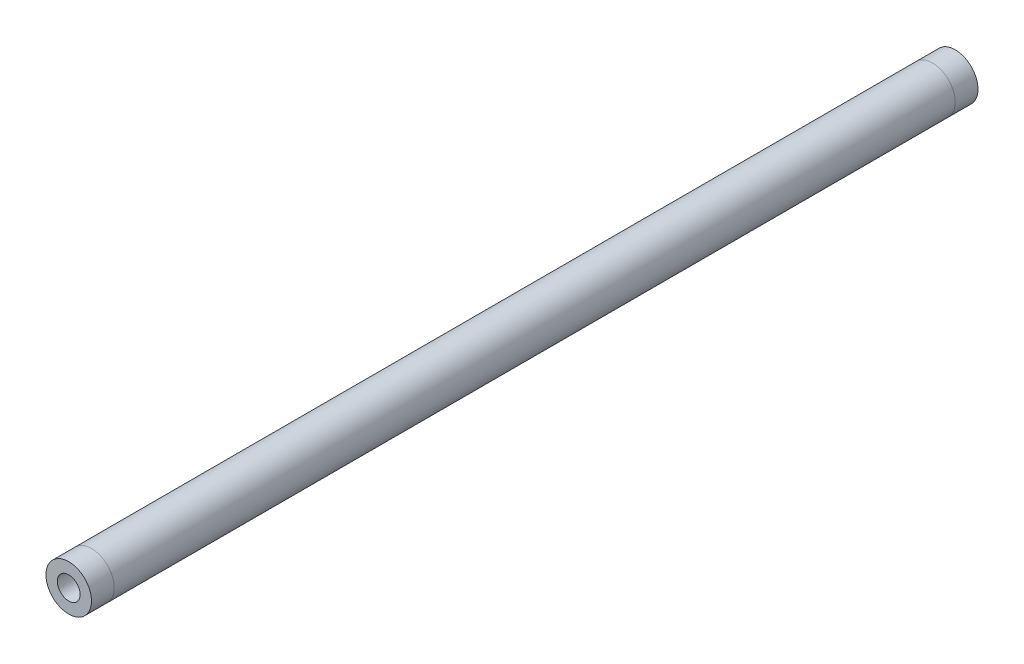
ISO-10303-21;
HEADER;
FILE_DESCRIPTION(('STEP AP214'),'2;1');
FILE_NAME('part.step','',(''),(''),'','','');
FILE_SCHEMA(('AUTOMOTIVE_DESIGN { 1 0 10303 214 1 1 1 1 }'));
ENDSEC;
DATA;
#1=APPLICATION_CONTEXT('core data for automotive mechanical design processes');
#2=APPLICATION_PROTOCOL_DEFINITION('international standard','automotive_design',2000,#1);
#3=PRODUCT_CONTEXT('',#1,'mechanical');
#4=PRODUCT('Part','Part','',(#3));
#5=PRODUCT_RELATED_PRODUCT_CATEGORY('part','',(#4));
#6=PRODUCT_DEFINITION_FORMATION('','',#4);
#7=PRODUCT_DEFINITION_CONTEXT('part definition',#1,'design');
#8=PRODUCT_DEFINITION('design','',#6,#7);
#9=PRODUCT_DEFINITION_SHAPE('','',#8);
#10=(LENGTH_UNIT() NAMED_UNIT(*) SI_UNIT(.MILLI.,.METRE.));
#11=(NAMED_UNIT(*) PLANE_ANGLE_UNIT() SI_UNIT($,.RADIAN.));
#12=(NAMED_UNIT(*) SI_UNIT($,.STERADIAN.) SOLID_ANGLE_UNIT());
#13=UNCERTAINTY_MEASURE_WITH_UNIT(LENGTH_MEASURE(1.E-05),#10,'distance_accuracy_value','');
#14=(GEOMETRIC_REPRESENTATION_CONTEXT(3) GLOBAL_UNCERTAINTY_ASSIGNED_CONTEXT((#13)) GLOBAL_UNIT_ASSIGNED_CONTEXT((#10,
#11,#12)) REPRESENTATION_CONTEXT('',''));
#15=CARTESIAN_POINT('',(0.,0.,0.));
#16=DIRECTION('',(0.,0.,1.));
#17=DIRECTION('',(1.,0.,0.));
#18=AXIS2_PLACEMENT_3D('',#15,#16,#17);
#19=CARTESIAN_POINT('',(0.,0.,-247.333789715624));
#20=DIRECTION('',(0.,0.,1.));
#21=DIRECTION('',(1.,0.,0.));
#22=AXIS2_PLACEMENT_3D('',#19,#20,#21);
#23=CYLINDRICAL_SURFACE('',#22,6.35);
#24=CARTESIAN_POINT('',(0.,0.,-247.333789715624));
#25=DIRECTION('',(0.,0.,1.));
#26=DIRECTION('',(1.,0.,0.));
#27=AXIS2_PLACEMENT_3D('',#24,#25,#26);
#28=CIRCLE('',#27,6.35);
#29=CARTESIAN_POINT('',(6.35,0.,-247.333789715624));
#30=VERTEX_POINT('',#29);
#31=EDGE_CURVE('E85',#30,#30,#28,.T.);
#32=ORIENTED_EDGE('',*,*,#31,.T.);
#33=EDGE_LOOP('',(#32));
#34=FACE_BOUND('',#33,.T.);
#35=CARTESIAN_POINT('',(0.,0.,-240.983789715624));
#36=DIRECTION('',(0.,0.,1.));
#37=DIRECTION('',(1.,0.,0.));
#38=AXIS2_PLACEMENT_3D('',#35,#36,#37);
#39=CIRCLE('',#38,6.35);
#40=CARTESIAN_POINT('',(6.35,0.,-240.983789715624));
#41=VERTEX_POINT('',#40);
#42=EDGE_CURVE('E81',#41,#41,#39,.T.);
#43=ORIENTED_EDGE('',*,*,#42,.F.);
#44=EDGE_LOOP('',(#43));
#45=FACE_BOUND('',#44,.T.);
#46=ADVANCED_FACE('F78',(#34,#45),#23,.T.);
#47=CARTESIAN_POINT('',(0.,0.,-247.333789715624));
#48=DIRECTION('',(0.,0.,1.));
#49=DIRECTION('',(1.,0.,0.));
#50=AXIS2_PLACEMENT_3D('',#47,#48,#49);
#51=PLANE('',#50);
#52=CARTESIAN_POINT('',(0.,0.,-247.333789715624));
#53=DIRECTION('',(0.,0.,1.));
#54=DIRECTION('',(1.,0.,0.));
#55=AXIS2_PLACEMENT_3D('',#52,#53,#54);
#56=CIRCLE('',#55,3.175);
#57=CARTESIAN_POINT('',(3.175,0.,-247.333789715624));
#58=VERTEX_POINT('',#57);
#59=EDGE_CURVE('E94',#58,#58,#56,.T.);
#60=ORIENTED_EDGE('',*,*,#59,.T.);
#61=EDGE_LOOP('',(#60));
#62=FACE_BOUND('',#61,.T.);
#63=ORIENTED_EDGE('',*,*,#31,.F.);
#64=EDGE_LOOP('',(#63));
#65=FACE_BOUND('',#64,.T.);
#66=ADVANCED_FACE('F121',(#62,#65),#51,.F.);
#67=CARTESIAN_POINT('',(0.,0.,-240.983789715624));
#68=DIRECTION('',(0.,0.,1.));
#69=DIRECTION('',(1.,0.,0.));
#70=AXIS2_PLACEMENT_3D('',#67,#68,#69);
#71=PLANE('',#70);
#72=CARTESIAN_POINT('',(0.,0.,-240.983789715624));
#73=DIRECTION('',(0.,0.,1.));
#74=DIRECTION('',(1.,0.,0.));
#75=AXIS2_PLACEMENT_3D('',#72,#73,#74);
#76=CIRCLE('',#75,4.8768);
#77=CARTESIAN_POINT('',(4.8768,0.,-240.983789715624));
#78=VERTEX_POINT('',#77);
#79=EDGE_CURVE('E12',#78,#78,#76,.T.);
#80=ORIENTED_EDGE('',*,*,#79,.F.);
#81=EDGE_LOOP('',(#80));
#82=FACE_BOUND('',#81,.T.);
#83=ORIENTED_EDGE('',*,*,#42,.T.);
#84=EDGE_LOOP('',(#83));
#85=FACE_BOUND('',#84,.T.);
#86=ADVANCED_FACE('F117',(#82,#85),#71,.T.);
#87=CARTESIAN_POINT('',(0.,0.,-247.333789715624));
#88=DIRECTION('',(0.,0.,1.));
#89=DIRECTION('',(1.,0.,0.));
#90=AXIS2_PLACEMENT_3D('',#87,#88,#89);
#91=CYLINDRICAL_SURFACE('',#90,3.175);
#92=ORIENTED_EDGE('',*,*,#59,.F.);
#93=EDGE_LOOP('',(#92));
#94=FACE_BOUND('',#93,.T.);
#95=CARTESIAN_POINT('',(0.,0.,-234.633789715624));
#96=DIRECTION('',(0.,0.,1.));
#97=DIRECTION('',(1.,0.,0.));
#98=AXIS2_PLACEMENT_3D('',#95,#96,#97);
#99=CIRCLE('',#98,3.175);
#100=CARTESIAN_POINT('',(3.175,0.,-234.633789715624));
#101=VERTEX_POINT('',#100);
#102=EDGE_CURVE('E100',#101,#101,#99,.T.);
#103=ORIENTED_EDGE('',*,*,#102,.T.);
#104=EDGE_LOOP('',(#103));
#105=FACE_BOUND('',#104,.T.);
#106=ADVANCED_FACE('F106',(#94,#105),#91,.F.);
#107=CARTESIAN_POINT('',(0.,0.,-234.633789715624));
#108=DIRECTION('',(0.,0.,1.));
#109=DIRECTION('',(1.,0.,0.));
#110=AXIS2_PLACEMENT_3D('',#107,#108,#109);
#111=PLANE('',#110);
#112=CARTESIAN_POINT('',(0.,0.,-234.633789715624));
#113=DIRECTION('',(0.,0.,1.));
#114=DIRECTION('',(1.,0.,0.));
#115=AXIS2_PLACEMENT_3D('',#112,#113,#114);
#116=CIRCLE('',#115,4.8768);
#117=CARTESIAN_POINT('',(4.8768,0.,-234.633789715624));
#118=VERTEX_POINT('',#117);
#119=EDGE_CURVE('E92',#118,#118,#116,.T.);
#120=ORIENTED_EDGE('',*,*,#119,.T.);
#121=EDGE_LOOP('',(#120));
#122=FACE_BOUND('',#121,.T.);
#123=ORIENTED_EDGE('',*,*,#102,.F.);
#124=EDGE_LOOP('',(#123));
#125=FACE_BOUND('',#124,.T.);
#126=ADVANCED_FACE('F108',(#122,#125),#111,.T.);
#127=CARTESIAN_POINT('',(0.,0.,-234.633789715624));
#128=DIRECTION('',(0.,0.,-1.));
#129=DIRECTION('',(-1.,0.,0.));
#130=AXIS2_PLACEMENT_3D('',#127,#128,#129);
#131=CYLINDRICAL_SURFACE('',#130,4.8768);
#132=ORIENTED_EDGE('',*,*,#119,.F.);
#133=EDGE_LOOP('',(#132));
#134=FACE_BOUND('',#133,.T.);
#135=ORIENTED_EDGE('',*,*,#79,.T.);
#136=EDGE_LOOP('',(#135));
#137=FACE_BOUND('',#136,.T.);
#138=ADVANCED_FACE('F110',(#134,#137),#131,.T.);
#139=CLOSED_SHELL('',(#46,#66,#86,#106,#126,#138));
#140=MANIFOLD_SOLID_BREP('B2',#139);
#141=CARTESIAN_POINT('',(0.,0.,-240.983789715624));
#142=DIRECTION('',(0.,0.,1.));
#143=DIRECTION('',(1.,0.,0.));
#144=AXIS2_PLACEMENT_3D('',#141,#142,#143);
#145=CYLINDRICAL_SURFACE('',#144,6.35);
#146=CARTESIAN_POINT('',(0.,0.,-240.983789715624));
#147=DIRECTION('',(0.,0.,1.));
#148=DIRECTION('',(1.,0.,0.));
#149=AXIS2_PLACEMENT_3D('',#146,#147,#148);
#150=CIRCLE('',#149,6.35);
#151=CARTESIAN_POINT('',(6.35,0.,-240.983789715624));
#152=VERTEX_POINT('',#151);
#153=EDGE_CURVE('E77',#152,#152,#150,.T.);
#154=ORIENTED_EDGE('',*,*,#153,.T.);
#155=EDGE_LOOP('',(#154));
#156=FACE_BOUND('',#155,.T.);
#157=CARTESIAN_POINT('',(0.,0.,-6.35));
#158=DIRECTION('',(0.,0.,1.));
#159=DIRECTION('',(1.,0.,0.));
#160=AXIS2_PLACEMENT_3D('',#157,#158,#159);
#161=CIRCLE('',#160,6.35);
#162=CARTESIAN_POINT('',(6.35,0.,-6.35));
#163=VERTEX_POINT('',#162);
#164=EDGE_CURVE('E193',#163,#163,#161,.T.);
#165=ORIENTED_EDGE('',*,*,#164,.F.);
#166=EDGE_LOOP('',(#165));
#167=FACE_BOUND('',#166,.T.);
#168=ADVANCED_FACE('F190',(#156,#167),#145,.T.);
#169=CARTESIAN_POINT('',(0.,0.,-240.983789715624));
#170=DIRECTION('',(0.,0.,1.));
#171=DIRECTION('',(1.,0.,0.));
#172=AXIS2_PLACEMENT_3D('',#169,#170,#171);
#173=PLANE('',#172);
#174=CARTESIAN_POINT('',(0.,0.,-240.983789715624));
#175=DIRECTION('',(0.,0.,1.));
#176=DIRECTION('',(1.,0.,0.));
#177=AXIS2_PLACEMENT_3D('',#174,#175,#176);
#178=CIRCLE('',#177,4.8768);
#179=CARTESIAN_POINT('',(4.8768,0.,-240.983789715624));
#180=VERTEX_POINT('',#179);
#181=EDGE_CURVE('E200',#180,#180,#178,.T.);
#182=ORIENTED_EDGE('',*,*,#181,.T.);
#183=EDGE_LOOP('',(#182));
#184=FACE_BOUND('',#183,.T.);
#185=ORIENTED_EDGE('',*,*,#153,.F.);
#186=EDGE_LOOP('',(#185));
#187=FACE_BOUND('',#186,.T.);
#188=ADVANCED_FACE('F208',(#184,#187),#173,.F.);
#189=CARTESIAN_POINT('',(0.,0.,-6.35));
#190=DIRECTION('',(0.,0.,1.));
#191=DIRECTION('',(1.,0.,0.));
#192=AXIS2_PLACEMENT_3D('',#189,#190,#191);
#193=PLANE('',#192);
#194=CARTESIAN_POINT('',(0.,0.,-6.35));
#195=DIRECTION('',(0.,0.,1.));
#196=DIRECTION('',(1.,0.,0.));
#197=AXIS2_PLACEMENT_3D('',#194,#195,#196);
#198=CIRCLE('',#197,4.8768);
#199=CARTESIAN_POINT('',(4.8768,0.,-6.35));
#200=VERTEX_POINT('',#199);
#201=EDGE_CURVE('E202',#200,#200,#198,.T.);
#202=ORIENTED_EDGE('',*,*,#201,.F.);
#203=EDGE_LOOP('',(#202));
#204=FACE_BOUND('',#203,.T.);
#205=ORIENTED_EDGE('',*,*,#164,.T.);
#206=EDGE_LOOP('',(#205));
#207=FACE_BOUND('',#206,.T.);
#208=ADVANCED_FACE('F214',(#204,#207),#193,.T.);
#209=CARTESIAN_POINT('',(0.,0.,-240.983789715624));
#210=DIRECTION('',(0.,0.,1.));
#211=DIRECTION('',(1.,0.,0.));
#212=AXIS2_PLACEMENT_3D('',#209,#210,#211);
#213=CYLINDRICAL_SURFACE('',#212,4.8768);
#214=ORIENTED_EDGE('',*,*,#181,.F.);
#215=EDGE_LOOP('',(#214));
#216=FACE_BOUND('',#215,.T.);
#217=ORIENTED_EDGE('',*,*,#201,.T.);
#218=EDGE_LOOP('',(#217));
#219=FACE_BOUND('',#218,.T.);
#220=ADVANCED_FACE('F211',(#216,#219),#213,.F.);
#221=CLOSED_SHELL('',(#168,#188,#208,#220));
#222=MANIFOLD_SOLID_BREP('B7',#221);
#223=CARTESIAN_POINT('',(0.,0.,-6.35));
#224=DIRECTION('',(0.,0.,1.));
#225=DIRECTION('',(1.,0.,0.));
#226=AXIS2_PLACEMENT_3D('',#223,#224,#225);
#227=CYLINDRICAL_SURFACE('',#226,6.35);
#228=CARTESIAN_POINT('',(0.,0.,-6.35));
#229=DIRECTION('',(0.,0.,1.));
#230=DIRECTION('',(1.,0.,0.));
#231=AXIS2_PLACEMENT_3D('',#228,#229,#230);
#232=CIRCLE('',#231,6.35);
#233=CARTESIAN_POINT('',(6.35,0.,-6.35));
#234=VERTEX_POINT('',#233);
#235=EDGE_CURVE('E189',#234,#234,#232,.T.);
#236=ORIENTED_EDGE('',*,*,#235,.T.);
#237=EDGE_LOOP('',(#236));
#238=FACE_BOUND('',#237,.T.);
#239=CARTESIAN_POINT('',(0.,0.,0.));
#240=DIRECTION('',(0.,0.,1.));
#241=DIRECTION('',(1.,0.,0.));
#242=AXIS2_PLACEMENT_3D('',#239,#240,#241);
#243=CIRCLE('',#242,6.35);
#244=CARTESIAN_POINT('',(6.35,0.,0.));
#245=VERTEX_POINT('',#244);
#246=EDGE_CURVE('E263',#245,#245,#243,.T.);
#247=ORIENTED_EDGE('',*,*,#246,.F.);
#248=EDGE_LOOP('',(#247));
#249=FACE_BOUND('',#248,.T.);
#250=ADVANCED_FACE('F252',(#238,#249),#227,.T.);
#251=CARTESIAN_POINT('',(0.,0.,-6.35));
#252=DIRECTION('',(0.,0.,1.));
#253=DIRECTION('',(1.,0.,0.));
#254=AXIS2_PLACEMENT_3D('',#251,#252,#253);
#255=CYLINDRICAL_SURFACE('',#254,3.175);
#256=CARTESIAN_POINT('',(0.,0.,0.));
#257=DIRECTION('',(0.,0.,1.));
#258=DIRECTION('',(1.,0.,0.));
#259=AXIS2_PLACEMENT_3D('',#256,#257,#258);
#260=CIRCLE('',#259,3.175);
#261=CARTESIAN_POINT('',(3.175,0.,0.));
#262=VERTEX_POINT('',#261);
#263=EDGE_CURVE('E255',#262,#262,#260,.T.);
#264=ORIENTED_EDGE('',*,*,#263,.T.);
#265=EDGE_LOOP('',(#264));
#266=FACE_BOUND('',#265,.T.);
#267=CARTESIAN_POINT('',(0.,0.,-12.7));
#268=DIRECTION('',(0.,0.,1.));
#269=DIRECTION('',(1.,0.,0.));
#270=AXIS2_PLACEMENT_3D('',#267,#268,#269);
#271=CIRCLE('',#270,3.175);
#272=CARTESIAN_POINT('',(3.175,0.,-12.7));
#273=VERTEX_POINT('',#272);
#274=EDGE_CURVE('E275',#273,#273,#271,.T.);
#275=ORIENTED_EDGE('',*,*,#274,.F.);
#276=EDGE_LOOP('',(#275));
#277=FACE_BOUND('',#276,.T.);
#278=ADVANCED_FACE('F283',(#266,#277),#255,.F.);
#279=CARTESIAN_POINT('',(0.,0.,-6.35));
#280=DIRECTION('',(0.,0.,1.));
#281=DIRECTION('',(1.,0.,0.));
#282=AXIS2_PLACEMENT_3D('',#279,#280,#281);
#283=PLANE('',#282);
#284=CARTESIAN_POINT('',(0.,0.,-6.35));
#285=DIRECTION('',(0.,0.,1.));
#286=DIRECTION('',(1.,0.,0.));
#287=AXIS2_PLACEMENT_3D('',#284,#285,#286);
#288=CIRCLE('',#287,4.8768);
#289=CARTESIAN_POINT('',(4.8768,0.,-6.35));
#290=VERTEX_POINT('',#289);
#291=EDGE_CURVE('E265',#290,#290,#288,.T.);
#292=ORIENTED_EDGE('',*,*,#291,.T.);
#293=EDGE_LOOP('',(#292));
#294=FACE_BOUND('',#293,.T.);
#295=ORIENTED_EDGE('',*,*,#235,.F.);
#296=EDGE_LOOP('',(#295));
#297=FACE_BOUND('',#296,.T.);
#298=ADVANCED_FACE('F285',(#294,#297),#283,.F.);
#299=CARTESIAN_POINT('',(0.,0.,0.));
#300=DIRECTION('',(0.,0.,1.));
#301=DIRECTION('',(1.,0.,0.));
#302=AXIS2_PLACEMENT_3D('',#299,#300,#301);
#303=PLANE('',#302);
#304=ORIENTED_EDGE('',*,*,#246,.T.);
#305=EDGE_LOOP('',(#304));
#306=FACE_BOUND('',#305,.T.);
#307=ORIENTED_EDGE('',*,*,#263,.F.);
#308=EDGE_LOOP('',(#307));
#309=FACE_BOUND('',#308,.T.);
#310=ADVANCED_FACE('F291',(#306,#309),#303,.T.);
#311=CARTESIAN_POINT('',(0.,0.,-12.7));
#312=DIRECTION('',(0.,0.,1.));
#313=DIRECTION('',(1.,0.,0.));
#314=AXIS2_PLACEMENT_3D('',#311,#312,#313);
#315=CYLINDRICAL_SURFACE('',#314,4.8768);
#316=CARTESIAN_POINT('',(0.,0.,-12.7));
#317=DIRECTION('',(0.,0.,1.));
#318=DIRECTION('',(1.,0.,0.));
#319=AXIS2_PLACEMENT_3D('',#316,#317,#318);
#320=CIRCLE('',#319,4.8768);
#321=CARTESIAN_POINT('',(4.8768,0.,-12.7));
#322=VERTEX_POINT('',#321);
#323=EDGE_CURVE('E268',#322,#322,#320,.T.);
#324=ORIENTED_EDGE('',*,*,#323,.T.);
#325=EDGE_LOOP('',(#324));
#326=FACE_BOUND('',#325,.T.);
#327=ORIENTED_EDGE('',*,*,#291,.F.);
#328=EDGE_LOOP('',(#327));
#329=FACE_BOUND('',#328,.T.);
#330=ADVANCED_FACE('F296',(#326,#329),#315,.T.);
#331=CARTESIAN_POINT('',(0.,0.,-12.7));
#332=DIRECTION('',(0.,0.,1.));
#333=DIRECTION('',(1.,0.,0.));
#334=AXIS2_PLACEMENT_3D('',#331,#332,#333);
#335=PLANE('',#334);
#336=ORIENTED_EDGE('',*,*,#274,.T.);
#337=EDGE_LOOP('',(#336));
#338=FACE_BOUND('',#337,.T.);
#339=ORIENTED_EDGE('',*,*,#323,.F.);
#340=EDGE_LOOP('',(#339));
#341=FACE_BOUND('',#340,.T.);
#342=ADVANCED_FACE('F280',(#338,#341),#335,.F.);
#343=CLOSED_SHELL('',(#250,#278,#298,#310,#330,#342));
#344=MANIFOLD_SOLID_BREP('B72',#343);
#345=ADVANCED_BREP_SHAPE_REPRESENTATION('',(#18,#140,#222,#344),#14);
#346=SHAPE_DEFINITION_REPRESENTATION(#9,#345);
ENDSEC;
END-ISO-10303-21;
